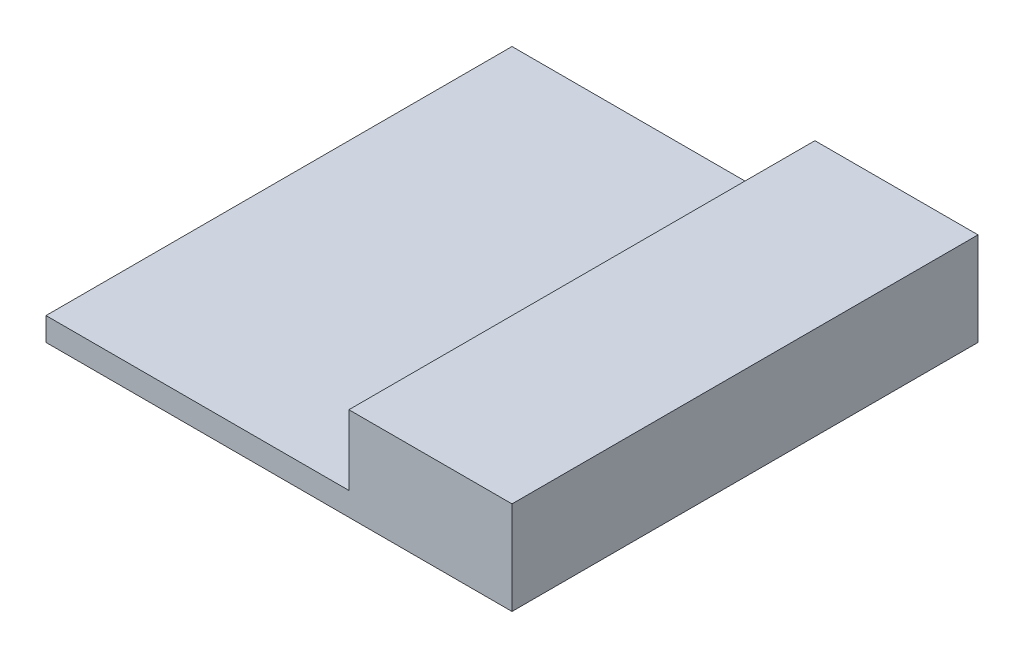
ISO-10303-21;
HEADER;
FILE_DESCRIPTION(('STEP AP214'),'2;1');
FILE_NAME('part.step','',(''),(''),'','','');
FILE_SCHEMA(('AUTOMOTIVE_DESIGN { 1 0 10303 214 1 1 1 1 }'));
ENDSEC;
DATA;
#1=APPLICATION_CONTEXT('core data for automotive mechanical design processes');
#2=APPLICATION_PROTOCOL_DEFINITION('international standard','automotive_design',2000,#1);
#3=PRODUCT_CONTEXT('',#1,'mechanical');
#4=PRODUCT('Part','Part','',(#3));
#5=PRODUCT_RELATED_PRODUCT_CATEGORY('part','',(#4));
#6=PRODUCT_DEFINITION_FORMATION('','',#4);
#7=PRODUCT_DEFINITION_CONTEXT('part definition',#1,'design');
#8=PRODUCT_DEFINITION('design','',#6,#7);
#9=PRODUCT_DEFINITION_SHAPE('','',#8);
#10=(LENGTH_UNIT() NAMED_UNIT(*) SI_UNIT(.MILLI.,.METRE.));
#11=(NAMED_UNIT(*) PLANE_ANGLE_UNIT() SI_UNIT($,.RADIAN.));
#12=(NAMED_UNIT(*) SI_UNIT($,.STERADIAN.) SOLID_ANGLE_UNIT());
#13=UNCERTAINTY_MEASURE_WITH_UNIT(LENGTH_MEASURE(1.E-05),#10,'distance_accuracy_value','');
#14=(GEOMETRIC_REPRESENTATION_CONTEXT(3) GLOBAL_UNCERTAINTY_ASSIGNED_CONTEXT((#13)) GLOBAL_UNIT_ASSIGNED_CONTEXT((#10,
#11,#12)) REPRESENTATION_CONTEXT('',''));
#15=CARTESIAN_POINT('',(0.,0.,0.));
#16=DIRECTION('',(0.,0.,1.));
#17=DIRECTION('',(1.,0.,0.));
#18=AXIS2_PLACEMENT_3D('',#15,#16,#17);
#19=CARTESIAN_POINT('',(0.,5.,0.));
#20=DIRECTION('',(1.,0.,0.));
#21=DIRECTION('',(0.,0.,-1.));
#22=AXIS2_PLACEMENT_3D('',#19,#20,#21);
#23=PLANE('',#22);
#24=DIRECTION('',(0.,0.,1.));
#25=VECTOR('',#24,1.);
#26=CARTESIAN_POINT('',(0.,0.,0.));
#27=LINE('',#26,#25);
#28=CARTESIAN_POINT('',(0.,0.,0.));
#29=VERTEX_POINT('',#28);
#30=CARTESIAN_POINT('',(0.,0.,100.));
#31=VERTEX_POINT('',#30);
#32=EDGE_CURVE('E91',#29,#31,#27,.T.);
#33=ORIENTED_EDGE('',*,*,#32,.T.);
#34=DIRECTION('',(0.,-1.,0.));
#35=VECTOR('',#34,1.);
#36=CARTESIAN_POINT('',(0.,5.,100.));
#37=LINE('',#36,#35);
#38=CARTESIAN_POINT('',(0.,5.,100.));
#39=VERTEX_POINT('',#38);
#40=EDGE_CURVE('E11',#39,#31,#37,.T.);
#41=ORIENTED_EDGE('',*,*,#40,.F.);
#42=DIRECTION('',(0.,0.,1.));
#43=VECTOR('',#42,1.);
#44=CARTESIAN_POINT('',(0.,5.,0.));
#45=LINE('',#44,#43);
#46=CARTESIAN_POINT('',(0.,5.,0.));
#47=VERTEX_POINT('',#46);
#48=EDGE_CURVE('E85',#47,#39,#45,.T.);
#49=ORIENTED_EDGE('',*,*,#48,.F.);
#50=DIRECTION('',(0.,-1.,0.));
#51=VECTOR('',#50,1.);
#52=CARTESIAN_POINT('',(0.,5.,0.));
#53=LINE('',#52,#51);
#54=EDGE_CURVE('E77',#47,#29,#53,.T.);
#55=ORIENTED_EDGE('',*,*,#54,.T.);
#56=EDGE_LOOP('',(#33,#41,#49,#55));
#57=FACE_BOUND('',#56,.T.);
#58=ADVANCED_FACE('F35',(#57),#23,.F.);
#59=CARTESIAN_POINT('',(0.,5.,100.));
#60=DIRECTION('',(0.,0.,-1.));
#61=DIRECTION('',(-1.,0.,0.));
#62=AXIS2_PLACEMENT_3D('',#59,#60,#61);
#63=PLANE('',#62);
#64=DIRECTION('',(1.,0.,0.));
#65=VECTOR('',#64,1.);
#66=CARTESIAN_POINT('',(0.,0.,100.));
#67=LINE('',#66,#65);
#68=CARTESIAN_POINT('',(100.,0.,100.));
#69=VERTEX_POINT('',#68);
#70=EDGE_CURVE('E94',#31,#69,#67,.T.);
#71=ORIENTED_EDGE('',*,*,#70,.T.);
#72=DIRECTION('',(0.,-1.,0.));
#73=VECTOR('',#72,1.);
#74=CARTESIAN_POINT('',(100.,5.,100.));
#75=LINE('',#74,#73);
#76=CARTESIAN_POINT('',(100.,20.,100.));
#77=VERTEX_POINT('',#76);
#78=EDGE_CURVE('E42',#77,#69,#75,.T.);
#79=ORIENTED_EDGE('',*,*,#78,.F.);
#80=DIRECTION('',(1.,0.,0.));
#81=VECTOR('',#80,1.);
#82=CARTESIAN_POINT('',(100.,20.,100.));
#83=LINE('',#82,#81);
#84=CARTESIAN_POINT('',(65.,20.,100.));
#85=VERTEX_POINT('',#84);
#86=EDGE_CURVE('E118',#85,#77,#83,.T.);
#87=ORIENTED_EDGE('',*,*,#86,.F.);
#88=DIRECTION('',(0.,-1.,0.));
#89=VECTOR('',#88,1.);
#90=CARTESIAN_POINT('',(65.,20.,100.));
#91=LINE('',#90,#89);
#92=CARTESIAN_POINT('',(65.,5.,100.));
#93=VERTEX_POINT('',#92);
#94=EDGE_CURVE('E99',#85,#93,#91,.T.);
#95=ORIENTED_EDGE('',*,*,#94,.T.);
#96=DIRECTION('',(1.,0.,0.));
#97=VECTOR('',#96,1.);
#98=CARTESIAN_POINT('',(0.,5.,100.));
#99=LINE('',#98,#97);
#100=EDGE_CURVE('E135',#39,#93,#99,.T.);
#101=ORIENTED_EDGE('',*,*,#100,.F.);
#102=ORIENTED_EDGE('',*,*,#40,.T.);
#103=EDGE_LOOP('',(#71,#79,#87,#95,#101,#102));
#104=FACE_BOUND('',#103,.T.);
#105=ADVANCED_FACE('F115',(#104),#63,.F.);
#106=CARTESIAN_POINT('',(100.,5.,0.));
#107=DIRECTION('',(-1.,0.,0.));
#108=DIRECTION('',(0.,0.,1.));
#109=AXIS2_PLACEMENT_3D('',#106,#107,#108);
#110=PLANE('',#109);
#111=DIRECTION('',(0.,0.,-1.));
#112=VECTOR('',#111,1.);
#113=CARTESIAN_POINT('',(100.,0.,0.));
#114=LINE('',#113,#112);
#115=CARTESIAN_POINT('',(100.,0.,0.));
#116=VERTEX_POINT('',#115);
#117=EDGE_CURVE('E86',#69,#116,#114,.T.);
#118=ORIENTED_EDGE('',*,*,#117,.T.);
#119=DIRECTION('',(0.,-1.,0.));
#120=VECTOR('',#119,1.);
#121=CARTESIAN_POINT('',(100.,5.,0.));
#122=LINE('',#121,#120);
#123=CARTESIAN_POINT('',(100.,20.,0.));
#124=VERTEX_POINT('',#123);
#125=EDGE_CURVE('E81',#124,#116,#122,.T.);
#126=ORIENTED_EDGE('',*,*,#125,.F.);
#127=DIRECTION('',(0.,0.,-1.));
#128=VECTOR('',#127,1.);
#129=CARTESIAN_POINT('',(100.,20.,0.));
#130=LINE('',#129,#128);
#131=EDGE_CURVE('E111',#77,#124,#130,.T.);
#132=ORIENTED_EDGE('',*,*,#131,.F.);
#133=ORIENTED_EDGE('',*,*,#78,.T.);
#134=EDGE_LOOP('',(#118,#126,#132,#133));
#135=FACE_BOUND('',#134,.T.);
#136=ADVANCED_FACE('F109',(#135),#110,.F.);
#137=CARTESIAN_POINT('',(0.,5.,0.));
#138=DIRECTION('',(0.,0.,1.));
#139=DIRECTION('',(1.,0.,0.));
#140=AXIS2_PLACEMENT_3D('',#137,#138,#139);
#141=PLANE('',#140);
#142=DIRECTION('',(-1.,0.,0.));
#143=VECTOR('',#142,1.);
#144=CARTESIAN_POINT('',(0.,0.,0.));
#145=LINE('',#144,#143);
#146=EDGE_CURVE('E74',#116,#29,#145,.T.);
#147=ORIENTED_EDGE('',*,*,#146,.T.);
#148=ORIENTED_EDGE('',*,*,#54,.F.);
#149=DIRECTION('',(-1.,0.,0.));
#150=VECTOR('',#149,1.);
#151=CARTESIAN_POINT('',(0.,5.,0.));
#152=LINE('',#151,#150);
#153=CARTESIAN_POINT('',(65.,5.,0.));
#154=VERTEX_POINT('',#153);
#155=EDGE_CURVE('E54',#154,#47,#152,.T.);
#156=ORIENTED_EDGE('',*,*,#155,.F.);
#157=DIRECTION('',(0.,-1.,0.));
#158=VECTOR('',#157,1.);
#159=CARTESIAN_POINT('',(65.,20.,0.));
#160=LINE('',#159,#158);
#161=CARTESIAN_POINT('',(65.,20.,0.));
#162=VERTEX_POINT('',#161);
#163=EDGE_CURVE('E95',#162,#154,#160,.T.);
#164=ORIENTED_EDGE('',*,*,#163,.F.);
#165=DIRECTION('',(-1.,0.,0.));
#166=VECTOR('',#165,1.);
#167=CARTESIAN_POINT('',(100.,20.,0.));
#168=LINE('',#167,#166);
#169=EDGE_CURVE('E130',#124,#162,#168,.T.);
#170=ORIENTED_EDGE('',*,*,#169,.F.);
#171=ORIENTED_EDGE('',*,*,#125,.T.);
#172=EDGE_LOOP('',(#147,#148,#156,#164,#170,#171));
#173=FACE_BOUND('',#172,.T.);
#174=ADVANCED_FACE('F76',(#173),#141,.F.);
#175=CARTESIAN_POINT('',(0.,5.,0.));
#176=DIRECTION('',(0.,1.,0.));
#177=DIRECTION('',(0.,0.,1.));
#178=AXIS2_PLACEMENT_3D('',#175,#176,#177);
#179=PLANE('',#178);
#180=DIRECTION('',(0.,0.,1.));
#181=VECTOR('',#180,1.);
#182=CARTESIAN_POINT('',(65.,5.,0.));
#183=LINE('',#182,#181);
#184=EDGE_CURVE('E49',#154,#93,#183,.T.);
#185=ORIENTED_EDGE('',*,*,#184,.F.);
#186=ORIENTED_EDGE('',*,*,#155,.T.);
#187=ORIENTED_EDGE('',*,*,#48,.T.);
#188=ORIENTED_EDGE('',*,*,#100,.T.);
#189=EDGE_LOOP('',(#185,#186,#187,#188));
#190=FACE_BOUND('',#189,.T.);
#191=ADVANCED_FACE('F137',(#190),#179,.T.);
#192=CARTESIAN_POINT('',(0.,0.,0.));
#193=DIRECTION('',(0.,1.,0.));
#194=DIRECTION('',(0.,0.,1.));
#195=AXIS2_PLACEMENT_3D('',#192,#193,#194);
#196=PLANE('',#195);
#197=ORIENTED_EDGE('',*,*,#32,.F.);
#198=ORIENTED_EDGE('',*,*,#146,.F.);
#199=ORIENTED_EDGE('',*,*,#117,.F.);
#200=ORIENTED_EDGE('',*,*,#70,.F.);
#201=EDGE_LOOP('',(#197,#198,#199,#200));
#202=FACE_BOUND('',#201,.T.);
#203=ADVANCED_FACE('F93',(#202),#196,.F.);
#204=CARTESIAN_POINT('',(65.,20.,0.));
#205=DIRECTION('',(1.,0.,0.));
#206=DIRECTION('',(0.,0.,-1.));
#207=AXIS2_PLACEMENT_3D('',#204,#205,#206);
#208=PLANE('',#207);
#209=ORIENTED_EDGE('',*,*,#184,.T.);
#210=ORIENTED_EDGE('',*,*,#94,.F.);
#211=DIRECTION('',(0.,0.,1.));
#212=VECTOR('',#211,1.);
#213=CARTESIAN_POINT('',(65.,20.,0.));
#214=LINE('',#213,#212);
#215=EDGE_CURVE('E126',#162,#85,#214,.T.);
#216=ORIENTED_EDGE('',*,*,#215,.F.);
#217=ORIENTED_EDGE('',*,*,#163,.T.);
#218=EDGE_LOOP('',(#209,#210,#216,#217));
#219=FACE_BOUND('',#218,.T.);
#220=ADVANCED_FACE('F139',(#219),#208,.F.);
#221=CARTESIAN_POINT('',(0.,20.,0.));
#222=DIRECTION('',(0.,-1.,0.));
#223=DIRECTION('',(0.,0.,-1.));
#224=AXIS2_PLACEMENT_3D('',#221,#222,#223);
#225=PLANE('',#224);
#226=ORIENTED_EDGE('',*,*,#131,.T.);
#227=ORIENTED_EDGE('',*,*,#169,.T.);
#228=ORIENTED_EDGE('',*,*,#215,.T.);
#229=ORIENTED_EDGE('',*,*,#86,.T.);
#230=EDGE_LOOP('',(#226,#227,#228,#229));
#231=FACE_BOUND('',#230,.T.);
#232=ADVANCED_FACE('F122',(#231),#225,.F.);
#233=CLOSED_SHELL('',(#58,#105,#136,#174,#191,#203,#220,#232));
#234=MANIFOLD_SOLID_BREP('B2',#233);
#235=ADVANCED_BREP_SHAPE_REPRESENTATION('',(#18,#234),#14);
#236=SHAPE_DEFINITION_REPRESENTATION(#9,#235);
ENDSEC;
END-ISO-10303-21;
